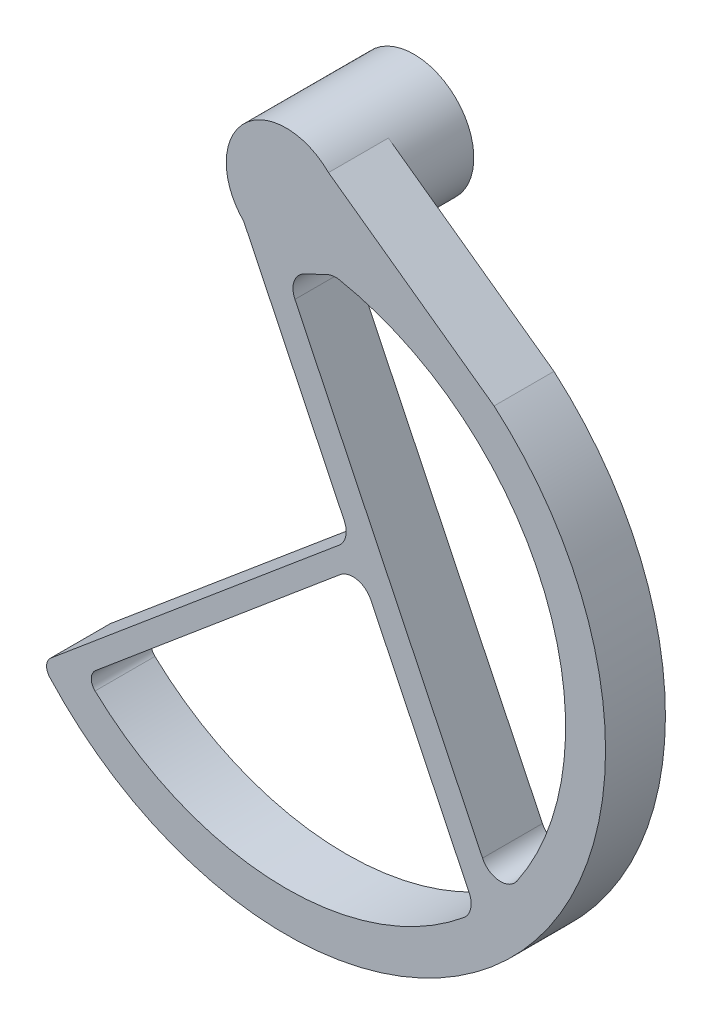
ISO-10303-21;
HEADER;
FILE_DESCRIPTION(('STEP AP214'),'2;1');
FILE_NAME('part.step','',(''),(''),'','','');
FILE_SCHEMA(('AUTOMOTIVE_DESIGN { 1 0 10303 214 1 1 1 1 }'));
ENDSEC;
DATA;
#1=APPLICATION_CONTEXT('core data for automotive mechanical design processes');
#2=APPLICATION_PROTOCOL_DEFINITION('international standard','automotive_design',2000,#1);
#3=PRODUCT_CONTEXT('',#1,'mechanical');
#4=PRODUCT('Part','Part','',(#3));
#5=PRODUCT_RELATED_PRODUCT_CATEGORY('part','',(#4));
#6=PRODUCT_DEFINITION_FORMATION('','',#4);
#7=PRODUCT_DEFINITION_CONTEXT('part definition',#1,'design');
#8=PRODUCT_DEFINITION('design','',#6,#7);
#9=PRODUCT_DEFINITION_SHAPE('','',#8);
#10=(LENGTH_UNIT() NAMED_UNIT(*) SI_UNIT(.MILLI.,.METRE.));
#11=(NAMED_UNIT(*) PLANE_ANGLE_UNIT() SI_UNIT($,.RADIAN.));
#12=(NAMED_UNIT(*) SI_UNIT($,.STERADIAN.) SOLID_ANGLE_UNIT());
#13=UNCERTAINTY_MEASURE_WITH_UNIT(LENGTH_MEASURE(1.E-05),#10,'distance_accuracy_value','');
#14=(GEOMETRIC_REPRESENTATION_CONTEXT(3) GLOBAL_UNCERTAINTY_ASSIGNED_CONTEXT((#13)) GLOBAL_UNIT_ASSIGNED_CONTEXT((#10,
#11,#12)) REPRESENTATION_CONTEXT('',''));
#15=CARTESIAN_POINT('',(0.,0.,0.));
#16=DIRECTION('',(0.,0.,1.));
#17=DIRECTION('',(1.,0.,0.));
#18=AXIS2_PLACEMENT_3D('',#15,#16,#17);
#19=CARTESIAN_POINT('',(0.,0.,0.));
#20=DIRECTION('',(0.,0.,1.));
#21=DIRECTION('',(1.,0.,0.));
#22=AXIS2_PLACEMENT_3D('',#19,#20,#21);
#23=PLANE('',#22);
#24=DIRECTION('',(0.433389731511241,-0.901206602628173,0.));
#25=VECTOR('',#24,1.);
#26=CARTESIAN_POINT('',(-12.7570586950624,-6.1348621133076,0.));
#27=LINE('',#26,#25);
#28=CARTESIAN_POINT('',(21.2324006956412,-76.8137984043253,0.));
#29=VERTEX_POINT('',#28);
#30=CARTESIAN_POINT('',(45.844843506453,-127.9938203457,0.));
#31=VERTEX_POINT('',#30);
#32=EDGE_CURVE('E206',#29,#31,#27,.T.);
#33=ORIENTED_EDGE('',*,*,#32,.F.);
#34=CARTESIAN_POINT('',(16.7263676825004,-78.9807470618814,0.));
#35=DIRECTION('',(0.,0.,1.));
#36=DIRECTION('',(1.,0.,0.));
#37=AXIS2_PLACEMENT_3D('',#34,#35,#36);
#38=CIRCLE('',#37,5.);
#39=CARTESIAN_POINT('',(13.5112294647628,-75.1515322284145,0.));
#40=VERTEX_POINT('',#39);
#41=EDGE_CURVE('E278',#40,#29,#38,.F.);
#42=ORIENTED_EDGE('',*,*,#41,.F.);
#43=DIRECTION('',(0.765842966693394,0.643027643547508,0.));
#44=VECTOR('',#43,1.);
#45=CARTESIAN_POINT('',(42.5956727933285,-50.7312504333006,0.));
#46=LINE('',#45,#44);
#47=CARTESIAN_POINT('',(-47.7476784165524,-126.586582094174,0.));
#48=VERTEX_POINT('',#47);
#49=EDGE_CURVE('E322',#48,#40,#46,.T.);
#50=ORIENTED_EDGE('',*,*,#49,.F.);
#51=CARTESIAN_POINT('',(-45.8185954859101,-128.884110994254,0.));
#52=DIRECTION('',(0.,0.,1.));
#53=DIRECTION('',(1.,0.,0.));
#54=AXIS2_PLACEMENT_3D('',#51,#52,#53);
#55=CIRCLE('',#54,2.99999999999979);
#56=CARTESIAN_POINT('',(-47.870174388264,-131.072951785042,0.));
#57=VERTEX_POINT('',#56);
#58=EDGE_CURVE('E320',#57,#48,#55,.F.);
#59=ORIENTED_EDGE('',*,*,#58,.F.);
#60=CARTESIAN_POINT('',(0.,-80.,0.));
#61=DIRECTION('',(0.,0.,1.));
#62=DIRECTION('',(1.,0.,0.));
#63=AXIS2_PLACEMENT_3D('',#60,#61,#62);
#64=CIRCLE('',#63,70.);
#65=CARTESIAN_POINT('',(44.5187189927976,-134.019289695814,0.));
#66=VERTEX_POINT('',#65);
#67=EDGE_CURVE('E317',#57,#66,#64,.T.);
#68=ORIENTED_EDGE('',*,*,#67,.T.);
#69=CARTESIAN_POINT('',(41.3388104933121,-130.160769003256,0.));
#70=DIRECTION('',(0.,0.,1.));
#71=DIRECTION('',(1.,0.,0.));
#72=AXIS2_PLACEMENT_3D('',#69,#70,#71);
#73=CIRCLE('',#72,4.99999999999999);
#74=EDGE_CURVE('E314',#31,#66,#73,.F.);
#75=ORIENTED_EDGE('',*,*,#74,.F.);
#76=EDGE_LOOP('',(#33,#42,#50,#59,#68,#75));
#77=FACE_BOUND('',#76,.T.);
#78=CARTESIAN_POINT('',(0.,0.,0.));
#79=DIRECTION('',(0.,0.,-1.));
#80=DIRECTION('',(-1.,0.,0.));
#81=AXIS2_PLACEMENT_3D('',#78,#79,#80);
#82=CIRCLE('',#81,15.);
#83=CARTESIAN_POINT('',(10.6066017177981,10.6066017177983,0.));
#84=VERTEX_POINT('',#83);
#85=CARTESIAN_POINT('',(7.47266922099557,-13.0061222012399,0.));
#86=VERTEX_POINT('',#85);
#87=EDGE_CURVE('E174',#84,#86,#82,.T.);
#88=ORIENTED_EDGE('',*,*,#87,.F.);
#89=DIRECTION('',(0.811357931424902,-0.584549661802916,0.));
#90=VECTOR('',#89,1.);
#91=CARTESIAN_POINT('',(8.65474635415258,12.0128323695446,0.));
#92=LINE('',#91,#90);
#93=CARTESIAN_POINT('',(52.0761789176773,-19.2705047828153,0.));
#94=VERTEX_POINT('',#93);
#95=EDGE_CURVE('E178',#84,#94,#92,.T.);
#96=ORIENTED_EDGE('',*,*,#95,.T.);
#97=CARTESIAN_POINT('',(0.,-80.,0.));
#98=DIRECTION('',(0.,0.,1.));
#99=DIRECTION('',(1.,0.,0.));
#100=AXIS2_PLACEMENT_3D('',#97,#98,#99);
#101=CIRCLE('',#100,80.);
#102=CARTESIAN_POINT('',(-59.2335308651964,-133.771635843089,0.));
#103=VERTEX_POINT('',#102);
#104=EDGE_CURVE('E204',#103,#94,#101,.T.);
#105=ORIENTED_EDGE('',*,*,#104,.F.);
#106=CARTESIAN_POINT('',(-57.0122734577518,-131.755199498973,0.));
#107=DIRECTION('',(0.,0.,1.));
#108=DIRECTION('',(1.,0.,0.));
#109=AXIS2_PLACEMENT_3D('',#106,#107,#108);
#110=CIRCLE('',#109,2.99999999999976);
#111=CARTESIAN_POINT('',(-58.9406362868111,-129.457066169617,0.));
#112=VERTEX_POINT('',#111);
#113=EDGE_CURVE('E208',#103,#112,#110,.F.);
#114=ORIENTED_EDGE('',*,*,#113,.T.);
#115=DIRECTION('',(0.766044443118982,0.642787609686534,0.));
#116=VECTOR('',#115,1.);
#117=CARTESIAN_POINT('',(39.3923101204882,-46.9459271066778,0.));
#118=LINE('',#117,#116);
#119=CARTESIAN_POINT('',(13.2441851892925,-68.8868090924212,0.));
#120=VERTEX_POINT('',#119);
#121=EDGE_CURVE('E307',#112,#120,#118,.T.);
#122=ORIENTED_EDGE('',*,*,#121,.T.);
#123=CARTESIAN_POINT('',(10.0302471408598,-65.0565868768263,0.));
#124=DIRECTION('',(0.,0.,1.));
#125=DIRECTION('',(1.,0.,0.));
#126=AXIS2_PLACEMENT_3D('',#123,#124,#125);
#127=CIRCLE('',#126,5.);
#128=CARTESIAN_POINT('',(14.5362801540007,-62.8896382192701,0.));
#129=VERTEX_POINT('',#128);
#130=EDGE_CURVE('E264',#120,#129,#127,.T.);
#131=ORIENTED_EDGE('',*,*,#130,.T.);
#132=DIRECTION('',(0.433389731511242,-0.901206602628173,0.));
#133=VECTOR('',#132,1.);
#134=CARTESIAN_POINT('',(-12.7570586950624,-6.13486211330761,0.));
#135=LINE('',#134,#133);
#136=CARTESIAN_POINT('',(-10.6066017177981,-10.6066017177983,0.));
#137=VERTEX_POINT('',#136);
#138=EDGE_CURVE('E203',#137,#129,#135,.T.);
#139=ORIENTED_EDGE('',*,*,#138,.F.);
#140=CARTESIAN_POINT('',(5.49416198956526,-13.9575851791209,0.));
#141=VERTEX_POINT('',#140);
#142=EDGE_CURVE('E11',#141,#137,#82,.T.);
#143=ORIENTED_EDGE('',*,*,#142,.F.);
#144=DIRECTION('',(-0.90120660262817,-0.433389731511248,0.));
#145=VECTOR('',#144,1.);
#146=CARTESIAN_POINT('',(6.4834156052804,-13.4818536901804,0.));
#147=LINE('',#146,#145);
#148=CARTESIAN_POINT('',(4.54083614175573,-14.4160390253533,0.));
#149=VERTEX_POINT('',#148);
#150=EDGE_CURVE('E243',#141,#149,#147,.T.);
#151=ORIENTED_EDGE('',*,*,#150,.T.);
#152=CARTESIAN_POINT('',(6.70778479931193,-18.9220720384942,0.));
#153=DIRECTION('',(0.,0.,1.));
#154=DIRECTION('',(-1.,0.,0.));
#155=AXIS2_PLACEMENT_3D('',#152,#153,#154);
#156=CIRCLE('',#155,5.);
#157=CARTESIAN_POINT('',(2.20175178617109,-21.0890206960504,0.));
#158=VERTEX_POINT('',#157);
#159=EDGE_CURVE('E230',#149,#158,#156,.T.);
#160=ORIENTED_EDGE('',*,*,#159,.T.);
#161=DIRECTION('',(0.433389731511244,-0.901206602628172,0.));
#162=VECTOR('',#161,1.);
#163=CARTESIAN_POINT('',(49.1895897966885,-118.797265214536,0.));
#164=LINE('',#163,#162);
#165=CARTESIAN_POINT('',(49.1895897966885,-118.797265214536,0.));
#166=VERTEX_POINT('',#165);
#167=EDGE_CURVE('E233',#158,#166,#164,.T.);
#168=ORIENTED_EDGE('',*,*,#167,.T.);
#169=CARTESIAN_POINT('',(53.6956228098294,-116.63031655698,0.));
#170=DIRECTION('',(0.,0.,1.));
#171=DIRECTION('',(-1.,0.,0.));
#172=AXIS2_PLACEMENT_3D('',#169,#170,#171);
#173=CIRCLE('',#172,5.);
#174=CARTESIAN_POINT('',(57.8260553336624,-119.448033215209,0.));
#175=VERTEX_POINT('',#174);
#176=EDGE_CURVE('E60',#166,#175,#173,.T.);
#177=ORIENTED_EDGE('',*,*,#176,.T.);
#178=CARTESIAN_POINT('',(0.,-80.,0.));
#179=DIRECTION('',(0.,0.,1.));
#180=DIRECTION('',(1.,0.,0.));
#181=AXIS2_PLACEMENT_3D('',#178,#179,#180);
#182=CIRCLE('',#181,69.9999999999999);
#183=CARTESIAN_POINT('',(13.3394234662008,-11.2827548457495,0.));
#184=VERTEX_POINT('',#183);
#185=EDGE_CURVE('E238',#175,#184,#182,.T.);
#186=ORIENTED_EDGE('',*,*,#185,.T.);
#187=CARTESIAN_POINT('',(12.3866075043293,-16.1911294996245,0.));
#188=DIRECTION('',(0.,0.,1.));
#189=DIRECTION('',(1.,0.,0.));
#190=AXIS2_PLACEMENT_3D('',#187,#188,#189);
#191=CIRCLE('',#190,5.);
#192=CARTESIAN_POINT('',(10.2196588467731,-11.6850964864837,0.));
#193=VERTEX_POINT('',#192);
#194=EDGE_CURVE('E241',#184,#193,#191,.T.);
#195=ORIENTED_EDGE('',*,*,#194,.T.);
#196=EDGE_CURVE('E181',#193,#86,#147,.T.);
#197=ORIENTED_EDGE('',*,*,#196,.T.);
#198=EDGE_LOOP('',(#88,#96,#105,#114,#122,#131,#139,#143,#151,#160,#168,#177,#186,#195,#197));
#199=FACE_BOUND('',#198,.T.);
#200=ADVANCED_FACE('F35',(#77,#199),#23,.F.);
#201=CARTESIAN_POINT('',(-12.7570586950624,-6.1348621133076,15.));
#202=DIRECTION('',(0.901206602628173,0.433389731511241,0.));
#203=DIRECTION('',(-0.433389731511241,0.901206602628173,0.));
#204=AXIS2_PLACEMENT_3D('',#201,#202,#203);
#205=PLANE('',#204);
#206=ORIENTED_EDGE('',*,*,#32,.T.);
#207=DIRECTION('',(0.,0.,-1.));
#208=VECTOR('',#207,1.);
#209=CARTESIAN_POINT('',(45.844843506453,-127.9938203457,15.));
#210=LINE('',#209,#208);
#211=CARTESIAN_POINT('',(45.844843506453,-127.9938203457,15.));
#212=VERTEX_POINT('',#211);
#213=EDGE_CURVE('E44',#212,#31,#210,.T.);
#214=ORIENTED_EDGE('',*,*,#213,.F.);
#215=DIRECTION('',(0.433389731511241,-0.901206602628173,0.));
#216=VECTOR('',#215,1.);
#217=CARTESIAN_POINT('',(-12.7570586950624,-6.1348621133076,15.));
#218=LINE('',#217,#216);
#219=CARTESIAN_POINT('',(21.2324006956412,-76.8137984043253,15.));
#220=VERTEX_POINT('',#219);
#221=EDGE_CURVE('E291',#220,#212,#218,.T.);
#222=ORIENTED_EDGE('',*,*,#221,.F.);
#223=DIRECTION('',(0.,0.,-1.));
#224=VECTOR('',#223,1.);
#225=CARTESIAN_POINT('',(21.2324006956412,-76.8137984043253,15.));
#226=LINE('',#225,#224);
#227=EDGE_CURVE('E325',#220,#29,#226,.T.);
#228=ORIENTED_EDGE('',*,*,#227,.T.);
#229=EDGE_LOOP('',(#206,#214,#222,#228));
#230=FACE_BOUND('',#229,.T.);
#231=ADVANCED_FACE('F390',(#230),#205,.F.);
#232=CARTESIAN_POINT('',(41.3388104933121,-130.160769003256,15.));
#233=DIRECTION('',(0.,0.,-1.));
#234=DIRECTION('',(-1.,0.,0.));
#235=AXIS2_PLACEMENT_3D('',#232,#233,#234);
#236=CYLINDRICAL_SURFACE('',#235,4.99999999999999);
#237=ORIENTED_EDGE('',*,*,#74,.T.);
#238=DIRECTION('',(0.,0.,-1.));
#239=VECTOR('',#238,1.);
#240=CARTESIAN_POINT('',(44.5187189927976,-134.019289695814,15.));
#241=LINE('',#240,#239);
#242=CARTESIAN_POINT('',(44.5187189927976,-134.019289695814,15.));
#243=VERTEX_POINT('',#242);
#244=EDGE_CURVE('E336',#243,#66,#241,.T.);
#245=ORIENTED_EDGE('',*,*,#244,.F.);
#246=CARTESIAN_POINT('',(41.3388104933121,-130.160769003256,15.));
#247=DIRECTION('',(0.,0.,1.));
#248=DIRECTION('',(1.,0.,0.));
#249=AXIS2_PLACEMENT_3D('',#246,#247,#248);
#250=CIRCLE('',#249,4.99999999999999);
#251=EDGE_CURVE('E294',#212,#243,#250,.F.);
#252=ORIENTED_EDGE('',*,*,#251,.F.);
#253=ORIENTED_EDGE('',*,*,#213,.T.);
#254=EDGE_LOOP('',(#237,#245,#252,#253));
#255=FACE_BOUND('',#254,.T.);
#256=ADVANCED_FACE('F396',(#255),#236,.F.);
#257=CARTESIAN_POINT('',(0.,-80.,15.));
#258=DIRECTION('',(0.,0.,-1.));
#259=DIRECTION('',(-1.,0.,0.));
#260=AXIS2_PLACEMENT_3D('',#257,#258,#259);
#261=CYLINDRICAL_SURFACE('',#260,70.);
#262=ORIENTED_EDGE('',*,*,#67,.F.);
#263=DIRECTION('',(0.,0.,-1.));
#264=VECTOR('',#263,1.);
#265=CARTESIAN_POINT('',(-47.870174388264,-131.072951785042,15.));
#266=LINE('',#265,#264);
#267=CARTESIAN_POINT('',(-47.870174388264,-131.072951785042,15.));
#268=VERTEX_POINT('',#267);
#269=EDGE_CURVE('E334',#268,#57,#266,.T.);
#270=ORIENTED_EDGE('',*,*,#269,.F.);
#271=CARTESIAN_POINT('',(0.,-80.,15.));
#272=DIRECTION('',(0.,0.,1.));
#273=DIRECTION('',(1.,0.,0.));
#274=AXIS2_PLACEMENT_3D('',#271,#272,#273);
#275=CIRCLE('',#274,70.);
#276=EDGE_CURVE('E296',#268,#243,#275,.T.);
#277=ORIENTED_EDGE('',*,*,#276,.T.);
#278=ORIENTED_EDGE('',*,*,#244,.T.);
#279=EDGE_LOOP('',(#262,#270,#277,#278));
#280=FACE_BOUND('',#279,.T.);
#281=ADVANCED_FACE('F414',(#280),#261,.F.);
#282=CARTESIAN_POINT('',(-45.8185954859101,-128.884110994254,15.));
#283=DIRECTION('',(0.,0.,-1.));
#284=DIRECTION('',(-1.,0.,0.));
#285=AXIS2_PLACEMENT_3D('',#282,#283,#284);
#286=CYLINDRICAL_SURFACE('',#285,2.99999999999979);
#287=ORIENTED_EDGE('',*,*,#58,.T.);
#288=DIRECTION('',(0.,0.,-1.));
#289=VECTOR('',#288,1.);
#290=CARTESIAN_POINT('',(-47.7476784165524,-126.586582094174,15.));
#291=LINE('',#290,#289);
#292=CARTESIAN_POINT('',(-47.7476784165524,-126.586582094174,15.));
#293=VERTEX_POINT('',#292);
#294=EDGE_CURVE('E331',#293,#48,#291,.T.);
#295=ORIENTED_EDGE('',*,*,#294,.F.);
#296=CARTESIAN_POINT('',(-45.8185954859101,-128.884110994254,15.));
#297=DIRECTION('',(0.,0.,1.));
#298=DIRECTION('',(1.,0.,0.));
#299=AXIS2_PLACEMENT_3D('',#296,#297,#298);
#300=CIRCLE('',#299,2.99999999999979);
#301=EDGE_CURVE('E299',#268,#293,#300,.F.);
#302=ORIENTED_EDGE('',*,*,#301,.F.);
#303=ORIENTED_EDGE('',*,*,#269,.T.);
#304=EDGE_LOOP('',(#287,#295,#302,#303));
#305=FACE_BOUND('',#304,.T.);
#306=ADVANCED_FACE('F410',(#305),#286,.F.);
#307=CARTESIAN_POINT('',(42.5956727933285,-50.7312504333006,15.));
#308=DIRECTION('',(-0.643027643547508,0.765842966693394,0.));
#309=DIRECTION('',(-0.765842966693394,-0.643027643547508,0.));
#310=AXIS2_PLACEMENT_3D('',#307,#308,#309);
#311=PLANE('',#310);
#312=ORIENTED_EDGE('',*,*,#49,.T.);
#313=DIRECTION('',(0.,0.,-1.));
#314=VECTOR('',#313,1.);
#315=CARTESIAN_POINT('',(13.5112294647628,-75.1515322284145,15.));
#316=LINE('',#315,#314);
#317=CARTESIAN_POINT('',(13.5112294647628,-75.1515322284145,15.));
#318=VERTEX_POINT('',#317);
#319=EDGE_CURVE('E328',#318,#40,#316,.T.);
#320=ORIENTED_EDGE('',*,*,#319,.F.);
#321=DIRECTION('',(0.765842966693394,0.643027643547508,0.));
#322=VECTOR('',#321,1.);
#323=CARTESIAN_POINT('',(42.5956727933285,-50.7312504333006,15.));
#324=LINE('',#323,#322);
#325=EDGE_CURVE('E301',#293,#318,#324,.T.);
#326=ORIENTED_EDGE('',*,*,#325,.F.);
#327=ORIENTED_EDGE('',*,*,#294,.T.);
#328=EDGE_LOOP('',(#312,#320,#326,#327));
#329=FACE_BOUND('',#328,.T.);
#330=ADVANCED_FACE('F407',(#329),#311,.F.);
#331=CARTESIAN_POINT('',(10.0302471408598,-65.0565868768263,15.));
#332=DIRECTION('',(0.,0.,-1.));
#333=DIRECTION('',(-1.,0.,0.));
#334=AXIS2_PLACEMENT_3D('',#331,#332,#333);
#335=CYLINDRICAL_SURFACE('',#334,5.);
#336=ORIENTED_EDGE('',*,*,#130,.F.);
#337=DIRECTION('',(0.,0.,-1.));
#338=VECTOR('',#337,1.);
#339=CARTESIAN_POINT('',(13.2441851892925,-68.8868090924212,15.));
#340=LINE('',#339,#338);
#341=CARTESIAN_POINT('',(13.2441851892925,-68.8868090924212,15.));
#342=VERTEX_POINT('',#341);
#343=EDGE_CURVE('E222',#342,#120,#340,.T.);
#344=ORIENTED_EDGE('',*,*,#343,.F.);
#345=CARTESIAN_POINT('',(10.0302471408598,-65.0565868768263,15.));
#346=DIRECTION('',(0.,0.,1.));
#347=DIRECTION('',(1.,0.,0.));
#348=AXIS2_PLACEMENT_3D('',#345,#346,#347);
#349=CIRCLE('',#348,5.);
#350=CARTESIAN_POINT('',(14.5362801540007,-62.8896382192701,15.));
#351=VERTEX_POINT('',#350);
#352=EDGE_CURVE('E274',#342,#351,#349,.T.);
#353=ORIENTED_EDGE('',*,*,#352,.T.);
#354=DIRECTION('',(0.,0.,-1.));
#355=VECTOR('',#354,1.);
#356=CARTESIAN_POINT('',(14.5362801540007,-62.8896382192701,15.));
#357=LINE('',#356,#355);
#358=EDGE_CURVE('E218',#351,#129,#357,.T.);
#359=ORIENTED_EDGE('',*,*,#358,.T.);
#360=EDGE_LOOP('',(#336,#344,#353,#359));
#361=FACE_BOUND('',#360,.T.);
#362=ADVANCED_FACE('F37',(#361),#335,.F.);
#363=CARTESIAN_POINT('',(39.3923101204882,-46.9459271066778,15.));
#364=DIRECTION('',(-0.642787609686534,0.766044443118983,0.));
#365=DIRECTION('',(-0.766044443118982,-0.642787609686534,0.));
#366=AXIS2_PLACEMENT_3D('',#363,#364,#365);
#367=PLANE('',#366);
#368=ORIENTED_EDGE('',*,*,#121,.F.);
#369=DIRECTION('',(0.,0.,-1.));
#370=VECTOR('',#369,1.);
#371=CARTESIAN_POINT('',(-58.9406362868111,-129.457066169617,15.));
#372=LINE('',#371,#370);
#373=CARTESIAN_POINT('',(-58.9406362868111,-129.457066169617,15.));
#374=VERTEX_POINT('',#373);
#375=EDGE_CURVE('E343',#374,#112,#372,.T.);
#376=ORIENTED_EDGE('',*,*,#375,.F.);
#377=DIRECTION('',(0.766044443118982,0.642787609686534,0.));
#378=VECTOR('',#377,1.);
#379=CARTESIAN_POINT('',(39.3923101204882,-46.9459271066778,15.));
#380=LINE('',#379,#378);
#381=EDGE_CURVE('E277',#374,#342,#380,.T.);
#382=ORIENTED_EDGE('',*,*,#381,.T.);
#383=ORIENTED_EDGE('',*,*,#343,.T.);
#384=EDGE_LOOP('',(#368,#376,#382,#383));
#385=FACE_BOUND('',#384,.T.);
#386=ADVANCED_FACE('F349',(#385),#367,.T.);
#387=CARTESIAN_POINT('',(-57.0122734577518,-131.755199498973,15.));
#388=DIRECTION('',(0.,0.,-1.));
#389=DIRECTION('',(-1.,0.,0.));
#390=AXIS2_PLACEMENT_3D('',#387,#388,#389);
#391=CYLINDRICAL_SURFACE('',#390,2.99999999999976);
#392=ORIENTED_EDGE('',*,*,#113,.F.);
#393=DIRECTION('',(0.,0.,-1.));
#394=VECTOR('',#393,1.);
#395=CARTESIAN_POINT('',(-59.2335308651964,-133.771635843089,15.));
#396=LINE('',#395,#394);
#397=CARTESIAN_POINT('',(-59.2335308651964,-133.771635843089,15.));
#398=VERTEX_POINT('',#397);
#399=EDGE_CURVE('E342',#398,#103,#396,.T.);
#400=ORIENTED_EDGE('',*,*,#399,.F.);
#401=CARTESIAN_POINT('',(-57.0122734577518,-131.755199498973,15.));
#402=DIRECTION('',(0.,0.,1.));
#403=DIRECTION('',(1.,0.,0.));
#404=AXIS2_PLACEMENT_3D('',#401,#402,#403);
#405=CIRCLE('',#404,2.99999999999976);
#406=EDGE_CURVE('E281',#398,#374,#405,.F.);
#407=ORIENTED_EDGE('',*,*,#406,.T.);
#408=ORIENTED_EDGE('',*,*,#375,.T.);
#409=EDGE_LOOP('',(#392,#400,#407,#408));
#410=FACE_BOUND('',#409,.T.);
#411=ADVANCED_FACE('F355',(#410),#391,.T.);
#412=CARTESIAN_POINT('',(0.,-80.,15.));
#413=DIRECTION('',(0.,0.,-1.));
#414=DIRECTION('',(-1.,0.,0.));
#415=AXIS2_PLACEMENT_3D('',#412,#413,#414);
#416=CYLINDRICAL_SURFACE('',#415,80.);
#417=ORIENTED_EDGE('',*,*,#104,.T.);
#418=DIRECTION('',(0.,0.,-1.));
#419=VECTOR('',#418,1.);
#420=CARTESIAN_POINT('',(52.0761789176773,-19.2705047828153,15.));
#421=LINE('',#420,#419);
#422=CARTESIAN_POINT('',(52.0761789176773,-19.2705047828153,15.));
#423=VERTEX_POINT('',#422);
#424=EDGE_CURVE('E197',#423,#94,#421,.T.);
#425=ORIENTED_EDGE('',*,*,#424,.F.);
#426=CARTESIAN_POINT('',(0.,-80.,15.));
#427=DIRECTION('',(0.,0.,1.));
#428=DIRECTION('',(1.,0.,0.));
#429=AXIS2_PLACEMENT_3D('',#426,#427,#428);
#430=CIRCLE('',#429,80.);
#431=EDGE_CURVE('E284',#398,#423,#430,.T.);
#432=ORIENTED_EDGE('',*,*,#431,.F.);
#433=ORIENTED_EDGE('',*,*,#399,.T.);
#434=EDGE_LOOP('',(#417,#425,#432,#433));
#435=FACE_BOUND('',#434,.T.);
#436=ADVANCED_FACE('F359',(#435),#416,.T.);
#437=CARTESIAN_POINT('',(8.65474635415258,12.0128323695446,15.));
#438=DIRECTION('',(0.584549661802916,0.811357931424902,0.));
#439=DIRECTION('',(-0.811357931424902,0.584549661802916,0.));
#440=AXIS2_PLACEMENT_3D('',#437,#438,#439);
#441=PLANE('',#440);
#442=ORIENTED_EDGE('',*,*,#95,.F.);
#443=DIRECTION('',(0.,0.,-1.));
#444=VECTOR('',#443,1.);
#445=CARTESIAN_POINT('',(10.6066017177981,10.6066017177983,15.));
#446=LINE('',#445,#444);
#447=CARTESIAN_POINT('',(10.6066017177981,10.6066017177983,15.));
#448=VERTEX_POINT('',#447);
#449=EDGE_CURVE('E189',#448,#84,#446,.T.);
#450=ORIENTED_EDGE('',*,*,#449,.F.);
#451=DIRECTION('',(0.811357931424902,-0.584549661802916,0.));
#452=VECTOR('',#451,1.);
#453=CARTESIAN_POINT('',(8.65474635415258,12.0128323695446,15.));
#454=LINE('',#453,#452);
#455=EDGE_CURVE('E286',#448,#423,#454,.T.);
#456=ORIENTED_EDGE('',*,*,#455,.T.);
#457=ORIENTED_EDGE('',*,*,#424,.T.);
#458=EDGE_LOOP('',(#442,#450,#456,#457));
#459=FACE_BOUND('',#458,.T.);
#460=ADVANCED_FACE('F200',(#459),#441,.T.);
#461=CARTESIAN_POINT('',(0.,0.,15.));
#462=DIRECTION('',(0.,0.,-1.));
#463=DIRECTION('',(-1.,0.,0.));
#464=AXIS2_PLACEMENT_3D('',#461,#462,#463);
#465=CYLINDRICAL_SURFACE('',#464,15.);
#466=ORIENTED_EDGE('',*,*,#449,.T.);
#467=ORIENTED_EDGE('',*,*,#87,.T.);
#468=EDGE_CURVE('E186',#86,#141,#82,.T.);
#469=ORIENTED_EDGE('',*,*,#468,.T.);
#470=ORIENTED_EDGE('',*,*,#142,.T.);
#471=DIRECTION('',(0.,0.,-1.));
#472=VECTOR('',#471,1.);
#473=CARTESIAN_POINT('',(-10.6066017177981,-10.6066017177983,15.));
#474=LINE('',#473,#472);
#475=CARTESIAN_POINT('',(-10.6066017177981,-10.6066017177983,15.));
#476=VERTEX_POINT('',#475);
#477=EDGE_CURVE('E198',#476,#137,#474,.T.);
#478=ORIENTED_EDGE('',*,*,#477,.F.);
#479=CARTESIAN_POINT('',(0.,0.,15.));
#480=DIRECTION('',(0.,0.,1.));
#481=DIRECTION('',(1.,0.,0.));
#482=AXIS2_PLACEMENT_3D('',#479,#480,#481);
#483=CIRCLE('',#482,15.);
#484=EDGE_CURVE('E193',#448,#476,#483,.T.);
#485=ORIENTED_EDGE('',*,*,#484,.F.);
#486=EDGE_LOOP('',(#466,#467,#469,#470,#478,#485));
#487=FACE_BOUND('',#486,.T.);
#488=CARTESIAN_POINT('',(0.,0.,-17.));
#489=DIRECTION('',(0.,0.,-1.));
#490=DIRECTION('',(-1.,0.,0.));
#491=AXIS2_PLACEMENT_3D('',#488,#489,#490);
#492=CIRCLE('',#491,15.);
#493=CARTESIAN_POINT('',(-15.,0.,-17.));
#494=VERTEX_POINT('',#493);
#495=EDGE_CURVE('E185',#494,#494,#492,.T.);
#496=ORIENTED_EDGE('',*,*,#495,.F.);
#497=EDGE_LOOP('',(#496));
#498=FACE_BOUND('',#497,.T.);
#499=ADVANCED_FACE('F190',(#487,#498),#465,.T.);
#500=CARTESIAN_POINT('',(-12.7570586950624,-6.13486211330761,15.));
#501=DIRECTION('',(0.901206602628173,0.433389731511242,0.));
#502=DIRECTION('',(-0.433389731511242,0.901206602628173,0.));
#503=AXIS2_PLACEMENT_3D('',#500,#501,#502);
#504=PLANE('',#503);
#505=ORIENTED_EDGE('',*,*,#138,.T.);
#506=ORIENTED_EDGE('',*,*,#358,.F.);
#507=DIRECTION('',(0.433389731511242,-0.901206602628173,0.));
#508=VECTOR('',#507,1.);
#509=CARTESIAN_POINT('',(-12.7570586950624,-6.13486211330761,15.));
#510=LINE('',#509,#508);
#511=EDGE_CURVE('E289',#476,#351,#510,.T.);
#512=ORIENTED_EDGE('',*,*,#511,.F.);
#513=ORIENTED_EDGE('',*,*,#477,.T.);
#514=EDGE_LOOP('',(#505,#506,#512,#513));
#515=FACE_BOUND('',#514,.T.);
#516=ADVANCED_FACE('F365',(#515),#504,.F.);
#517=CARTESIAN_POINT('',(16.7263676825004,-78.9807470618814,15.));
#518=DIRECTION('',(0.,0.,-1.));
#519=DIRECTION('',(-1.,0.,0.));
#520=AXIS2_PLACEMENT_3D('',#517,#518,#519);
#521=CYLINDRICAL_SURFACE('',#520,5.);
#522=ORIENTED_EDGE('',*,*,#41,.T.);
#523=ORIENTED_EDGE('',*,*,#227,.F.);
#524=CARTESIAN_POINT('',(16.7263676825004,-78.9807470618814,15.));
#525=DIRECTION('',(0.,0.,1.));
#526=DIRECTION('',(1.,0.,0.));
#527=AXIS2_PLACEMENT_3D('',#524,#525,#526);
#528=CIRCLE('',#527,5.);
#529=EDGE_CURVE('E303',#318,#220,#528,.F.);
#530=ORIENTED_EDGE('',*,*,#529,.F.);
#531=ORIENTED_EDGE('',*,*,#319,.T.);
#532=EDGE_LOOP('',(#522,#523,#530,#531));
#533=FACE_BOUND('',#532,.T.);
#534=ADVANCED_FACE('F403',(#533),#521,.F.);
#535=CARTESIAN_POINT('',(0.,0.,15.));
#536=DIRECTION('',(0.,0.,1.));
#537=DIRECTION('',(1.,0.,0.));
#538=AXIS2_PLACEMENT_3D('',#535,#536,#537);
#539=PLANE('',#538);
#540=CARTESIAN_POINT('',(6.70778479931193,-18.9220720384942,15.));
#541=DIRECTION('',(0.,0.,1.));
#542=DIRECTION('',(-1.,0.,0.));
#543=AXIS2_PLACEMENT_3D('',#540,#541,#542);
#544=CIRCLE('',#543,5.);
#545=CARTESIAN_POINT('',(4.54083614175573,-14.4160390253533,15.));
#546=VERTEX_POINT('',#545);
#547=CARTESIAN_POINT('',(2.20175178617109,-21.0890206960504,15.));
#548=VERTEX_POINT('',#547);
#549=EDGE_CURVE('E52',#546,#548,#544,.T.);
#550=ORIENTED_EDGE('',*,*,#549,.F.);
#551=DIRECTION('',(-0.901206602628171,-0.433389731511247,0.));
#552=VECTOR('',#551,1.);
#553=CARTESIAN_POINT('',(6.4834156052804,-13.4818536901804,15.));
#554=LINE('',#553,#552);
#555=CARTESIAN_POINT('',(10.2196588467731,-11.6850964864837,15.));
#556=VERTEX_POINT('',#555);
#557=EDGE_CURVE('E234',#556,#546,#554,.T.);
#558=ORIENTED_EDGE('',*,*,#557,.F.);
#559=CARTESIAN_POINT('',(12.3866075043293,-16.1911294996245,15.));
#560=DIRECTION('',(0.,0.,1.));
#561=DIRECTION('',(1.,0.,0.));
#562=AXIS2_PLACEMENT_3D('',#559,#560,#561);
#563=CIRCLE('',#562,5.);
#564=CARTESIAN_POINT('',(13.3394234662008,-11.2827548457495,15.));
#565=VERTEX_POINT('',#564);
#566=EDGE_CURVE('E257',#565,#556,#563,.T.);
#567=ORIENTED_EDGE('',*,*,#566,.F.);
#568=CARTESIAN_POINT('',(0.,-80.,15.));
#569=DIRECTION('',(0.,0.,1.));
#570=DIRECTION('',(1.,0.,0.));
#571=AXIS2_PLACEMENT_3D('',#568,#569,#570);
#572=CIRCLE('',#571,69.9999999999999);
#573=CARTESIAN_POINT('',(57.8260553336624,-119.448033215209,15.));
#574=VERTEX_POINT('',#573);
#575=EDGE_CURVE('E254',#574,#565,#572,.T.);
#576=ORIENTED_EDGE('',*,*,#575,.F.);
#577=CARTESIAN_POINT('',(53.6956228098294,-116.63031655698,15.));
#578=DIRECTION('',(0.,0.,1.));
#579=DIRECTION('',(-1.,0.,0.));
#580=AXIS2_PLACEMENT_3D('',#577,#578,#579);
#581=CIRCLE('',#580,5.);
#582=CARTESIAN_POINT('',(49.1895897966885,-118.797265214536,15.));
#583=VERTEX_POINT('',#582);
#584=EDGE_CURVE('E251',#583,#574,#581,.T.);
#585=ORIENTED_EDGE('',*,*,#584,.F.);
#586=DIRECTION('',(0.433389731511244,-0.901206602628172,0.));
#587=VECTOR('',#586,1.);
#588=CARTESIAN_POINT('',(49.1895897966885,-118.797265214536,15.));
#589=LINE('',#588,#587);
#590=EDGE_CURVE('E248',#548,#583,#589,.T.);
#591=ORIENTED_EDGE('',*,*,#590,.F.);
#592=EDGE_LOOP('',(#550,#558,#567,#576,#585,#591));
#593=FACE_BOUND('',#592,.T.);
#594=ORIENTED_EDGE('',*,*,#352,.F.);
#595=ORIENTED_EDGE('',*,*,#381,.F.);
#596=ORIENTED_EDGE('',*,*,#406,.F.);
#597=ORIENTED_EDGE('',*,*,#431,.T.);
#598=ORIENTED_EDGE('',*,*,#455,.F.);
#599=ORIENTED_EDGE('',*,*,#484,.T.);
#600=ORIENTED_EDGE('',*,*,#511,.T.);
#601=EDGE_LOOP('',(#594,#595,#596,#597,#598,#599,#600));
#602=FACE_BOUND('',#601,.T.);
#603=ORIENTED_EDGE('',*,*,#221,.T.);
#604=ORIENTED_EDGE('',*,*,#251,.T.);
#605=ORIENTED_EDGE('',*,*,#276,.F.);
#606=ORIENTED_EDGE('',*,*,#301,.T.);
#607=ORIENTED_EDGE('',*,*,#325,.T.);
#608=ORIENTED_EDGE('',*,*,#529,.T.);
#609=EDGE_LOOP('',(#603,#604,#605,#606,#607,#608));
#610=FACE_BOUND('',#609,.T.);
#611=ADVANCED_FACE('F361',(#593,#602,#610),#539,.T.);
#612=CARTESIAN_POINT('',(6.70778479931193,-18.9220720384942,0.));
#613=DIRECTION('',(0.,0.,1.));
#614=DIRECTION('',(1.,0.,0.));
#615=AXIS2_PLACEMENT_3D('',#612,#613,#614);
#616=CYLINDRICAL_SURFACE('',#615,5.);
#617=ORIENTED_EDGE('',*,*,#549,.T.);
#618=DIRECTION('',(0.,0.,1.));
#619=VECTOR('',#618,1.);
#620=CARTESIAN_POINT('',(2.20175178617109,-21.0890206960504,0.));
#621=LINE('',#620,#619);
#622=EDGE_CURVE('E245',#158,#548,#621,.T.);
#623=ORIENTED_EDGE('',*,*,#622,.F.);
#624=ORIENTED_EDGE('',*,*,#159,.F.);
#625=DIRECTION('',(0.,0.,1.));
#626=VECTOR('',#625,1.);
#627=CARTESIAN_POINT('',(4.54083614175573,-14.4160390253533,0.));
#628=LINE('',#627,#626);
#629=EDGE_CURVE('E262',#149,#546,#628,.T.);
#630=ORIENTED_EDGE('',*,*,#629,.T.);
#631=EDGE_LOOP('',(#617,#623,#624,#630));
#632=FACE_BOUND('',#631,.T.);
#633=ADVANCED_FACE('F519',(#632),#616,.F.);
#634=CARTESIAN_POINT('',(6.4834156052804,-13.4818536901804,0.));
#635=DIRECTION('',(-0.433389731511247,0.901206602628171,0.));
#636=DIRECTION('',(-0.901206602628171,-0.433389731511247,0.));
#637=AXIS2_PLACEMENT_3D('',#634,#635,#636);
#638=PLANE('',#637);
#639=ORIENTED_EDGE('',*,*,#557,.T.);
#640=ORIENTED_EDGE('',*,*,#629,.F.);
#641=ORIENTED_EDGE('',*,*,#150,.F.);
#642=EDGE_CURVE('E246',#86,#141,#147,.T.);
#643=ORIENTED_EDGE('',*,*,#642,.F.);
#644=ORIENTED_EDGE('',*,*,#196,.F.);
#645=DIRECTION('',(0.,0.,1.));
#646=VECTOR('',#645,1.);
#647=CARTESIAN_POINT('',(10.2196588467731,-11.6850964864837,0.));
#648=LINE('',#647,#646);
#649=EDGE_CURVE('E265',#193,#556,#648,.T.);
#650=ORIENTED_EDGE('',*,*,#649,.T.);
#651=EDGE_LOOP('',(#639,#640,#641,#643,#644,#650));
#652=FACE_BOUND('',#651,.T.);
#653=ADVANCED_FACE('F370',(#652),#638,.F.);
#654=CARTESIAN_POINT('',(12.3866075043293,-16.1911294996245,0.));
#655=DIRECTION('',(0.,0.,1.));
#656=DIRECTION('',(1.,0.,0.));
#657=AXIS2_PLACEMENT_3D('',#654,#655,#656);
#658=CYLINDRICAL_SURFACE('',#657,5.);
#659=ORIENTED_EDGE('',*,*,#566,.T.);
#660=ORIENTED_EDGE('',*,*,#649,.F.);
#661=ORIENTED_EDGE('',*,*,#194,.F.);
#662=DIRECTION('',(0.,0.,1.));
#663=VECTOR('',#662,1.);
#664=CARTESIAN_POINT('',(13.3394234662008,-11.2827548457495,0.));
#665=LINE('',#664,#663);
#666=EDGE_CURVE('E267',#184,#565,#665,.T.);
#667=ORIENTED_EDGE('',*,*,#666,.T.);
#668=EDGE_LOOP('',(#659,#660,#661,#667));
#669=FACE_BOUND('',#668,.T.);
#670=ADVANCED_FACE('F533',(#669),#658,.F.);
#671=CARTESIAN_POINT('',(0.,-80.,0.));
#672=DIRECTION('',(0.,0.,1.));
#673=DIRECTION('',(1.,0.,0.));
#674=AXIS2_PLACEMENT_3D('',#671,#672,#673);
#675=CYLINDRICAL_SURFACE('',#674,69.9999999999999);
#676=ORIENTED_EDGE('',*,*,#575,.T.);
#677=ORIENTED_EDGE('',*,*,#666,.F.);
#678=ORIENTED_EDGE('',*,*,#185,.F.);
#679=DIRECTION('',(0.,0.,1.));
#680=VECTOR('',#679,1.);
#681=CARTESIAN_POINT('',(57.8260553336624,-119.448033215209,0.));
#682=LINE('',#681,#680);
#683=EDGE_CURVE('E269',#175,#574,#682,.T.);
#684=ORIENTED_EDGE('',*,*,#683,.T.);
#685=EDGE_LOOP('',(#676,#677,#678,#684));
#686=FACE_BOUND('',#685,.T.);
#687=ADVANCED_FACE('F542',(#686),#675,.F.);
#688=CARTESIAN_POINT('',(53.6956228098294,-116.63031655698,0.));
#689=DIRECTION('',(0.,0.,1.));
#690=DIRECTION('',(1.,0.,0.));
#691=AXIS2_PLACEMENT_3D('',#688,#689,#690);
#692=CYLINDRICAL_SURFACE('',#691,5.);
#693=ORIENTED_EDGE('',*,*,#584,.T.);
#694=ORIENTED_EDGE('',*,*,#683,.F.);
#695=ORIENTED_EDGE('',*,*,#176,.F.);
#696=DIRECTION('',(0.,0.,1.));
#697=VECTOR('',#696,1.);
#698=CARTESIAN_POINT('',(49.1895897966885,-118.797265214536,0.));
#699=LINE('',#698,#697);
#700=EDGE_CURVE('E271',#166,#583,#699,.T.);
#701=ORIENTED_EDGE('',*,*,#700,.T.);
#702=EDGE_LOOP('',(#693,#694,#695,#701));
#703=FACE_BOUND('',#702,.T.);
#704=ADVANCED_FACE('F385',(#703),#692,.F.);
#705=CARTESIAN_POINT('',(49.1895897966885,-118.797265214536,0.));
#706=DIRECTION('',(-0.901206602628172,-0.433389731511244,0.));
#707=DIRECTION('',(0.433389731511244,-0.901206602628172,0.));
#708=AXIS2_PLACEMENT_3D('',#705,#706,#707);
#709=PLANE('',#708);
#710=ORIENTED_EDGE('',*,*,#590,.T.);
#711=ORIENTED_EDGE('',*,*,#700,.F.);
#712=ORIENTED_EDGE('',*,*,#167,.F.);
#713=ORIENTED_EDGE('',*,*,#622,.T.);
#714=EDGE_LOOP('',(#710,#711,#712,#713));
#715=FACE_BOUND('',#714,.T.);
#716=ADVANCED_FACE('F376',(#715),#709,.F.);
#717=CARTESIAN_POINT('',(0.,0.,0.));
#718=DIRECTION('',(0.,0.,-1.));
#719=DIRECTION('',(-1.,0.,0.));
#720=AXIS2_PLACEMENT_3D('',#717,#718,#719);
#721=PLANE('',#720);
#722=ORIENTED_EDGE('',*,*,#468,.F.);
#723=ORIENTED_EDGE('',*,*,#642,.T.);
#724=EDGE_LOOP('',(#722,#723));
#725=FACE_BOUND('',#724,.T.);
#726=ADVANCED_FACE('F373',(#725),#721,.F.);
#727=CARTESIAN_POINT('',(0.,0.,-17.));
#728=DIRECTION('',(0.,0.,-1.));
#729=DIRECTION('',(-1.,0.,0.));
#730=AXIS2_PLACEMENT_3D('',#727,#728,#729);
#731=PLANE('',#730);
#732=CARTESIAN_POINT('',(0.,0.,-17.));
#733=DIRECTION('',(0.,0.,-1.));
#734=DIRECTION('',(-1.,0.,0.));
#735=AXIS2_PLACEMENT_3D('',#732,#733,#734);
#736=CIRCLE('',#735,10.1);
#737=CARTESIAN_POINT('',(-10.1,0.,-17.));
#738=VERTEX_POINT('',#737);
#739=EDGE_CURVE('E620',#738,#738,#736,.T.);
#740=ORIENTED_EDGE('',*,*,#739,.F.);
#741=EDGE_LOOP('',(#740));
#742=FACE_BOUND('',#741,.T.);
#743=ORIENTED_EDGE('',*,*,#495,.T.);
#744=EDGE_LOOP('',(#743));
#745=FACE_BOUND('',#744,.T.);
#746=ADVANCED_FACE('F375',(#742,#745),#731,.T.);
#747=CARTESIAN_POINT('',(0.,0.,-15.));
#748=DIRECTION('',(0.,0.,-1.));
#749=DIRECTION('',(-1.,0.,0.));
#750=AXIS2_PLACEMENT_3D('',#747,#748,#749);
#751=CYLINDRICAL_SURFACE('',#750,10.1);
#752=CARTESIAN_POINT('',(0.,0.,-15.));
#753=DIRECTION('',(0.,0.,-1.));
#754=DIRECTION('',(-1.,0.,0.));
#755=AXIS2_PLACEMENT_3D('',#752,#753,#754);
#756=CIRCLE('',#755,10.1);
#757=CARTESIAN_POINT('',(-10.1,0.,-15.));
#758=VERTEX_POINT('',#757);
#759=EDGE_CURVE('E229',#758,#758,#756,.T.);
#760=ORIENTED_EDGE('',*,*,#759,.F.);
#761=EDGE_LOOP('',(#760));
#762=FACE_BOUND('',#761,.T.);
#763=ORIENTED_EDGE('',*,*,#739,.T.);
#764=EDGE_LOOP('',(#763));
#765=FACE_BOUND('',#764,.T.);
#766=ADVANCED_FACE('F382',(#762,#765),#751,.F.);
#767=CARTESIAN_POINT('',(0.,0.,-15.));
#768=DIRECTION('',(0.,0.,-1.));
#769=DIRECTION('',(-1.,0.,0.));
#770=AXIS2_PLACEMENT_3D('',#767,#768,#769);
#771=PLANE('',#770);
#772=ORIENTED_EDGE('',*,*,#759,.T.);
#773=EDGE_LOOP('',(#772));
#774=FACE_BOUND('',#773,.T.);
#775=ADVANCED_FACE('F604',(#774),#771,.T.);
#776=CLOSED_SHELL('',(#200,#231,#256,#281,#306,#330,#362,#386,#411,#436,#460,#499,#516,#534,
#611,#633,#653,#670,#687,#704,#716,#726,#746,#766,#775));
#777=MANIFOLD_SOLID_BREP('B2',#776);
#778=ADVANCED_BREP_SHAPE_REPRESENTATION('',(#18,#777),#14);
#779=SHAPE_DEFINITION_REPRESENTATION(#9,#778);
ENDSEC;
END-ISO-10303-21;
